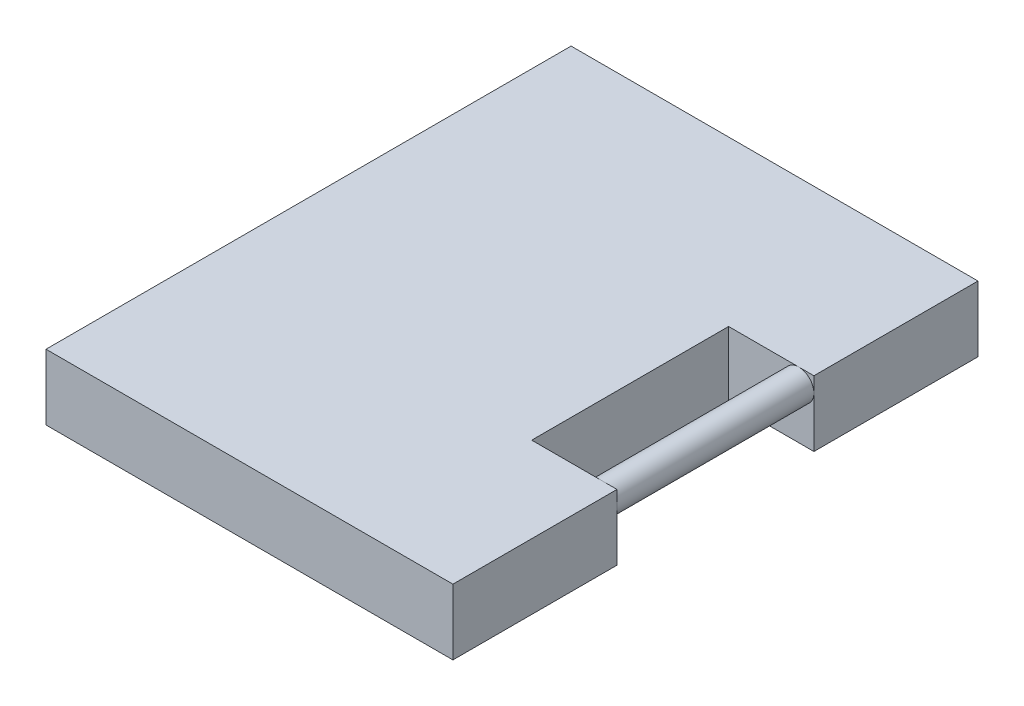
ISO-10303-21;
HEADER;
FILE_DESCRIPTION(('STEP AP214'),'2;1');
FILE_NAME('part.step','',(''),(''),'','','');
FILE_SCHEMA(('AUTOMOTIVE_DESIGN { 1 0 10303 214 1 1 1 1 }'));
ENDSEC;
DATA;
#1=APPLICATION_CONTEXT('core data for automotive mechanical design processes');
#2=APPLICATION_PROTOCOL_DEFINITION('international standard','automotive_design',2000,#1);
#3=PRODUCT_CONTEXT('',#1,'mechanical');
#4=PRODUCT('Part','Part','',(#3));
#5=PRODUCT_RELATED_PRODUCT_CATEGORY('part','',(#4));
#6=PRODUCT_DEFINITION_FORMATION('','',#4);
#7=PRODUCT_DEFINITION_CONTEXT('part definition',#1,'design');
#8=PRODUCT_DEFINITION('design','',#6,#7);
#9=PRODUCT_DEFINITION_SHAPE('','',#8);
#10=(LENGTH_UNIT() NAMED_UNIT(*) SI_UNIT(.MILLI.,.METRE.));
#11=(NAMED_UNIT(*) PLANE_ANGLE_UNIT() SI_UNIT($,.RADIAN.));
#12=(NAMED_UNIT(*) SI_UNIT($,.STERADIAN.) SOLID_ANGLE_UNIT());
#13=UNCERTAINTY_MEASURE_WITH_UNIT(LENGTH_MEASURE(1.E-05),#10,'distance_accuracy_value','');
#14=(GEOMETRIC_REPRESENTATION_CONTEXT(3) GLOBAL_UNCERTAINTY_ASSIGNED_CONTEXT((#13)) GLOBAL_UNIT_ASSIGNED_CONTEXT((#10,
#11,#12)) REPRESENTATION_CONTEXT('',''));
#15=CARTESIAN_POINT('',(0.,0.,0.));
#16=DIRECTION('',(0.,0.,1.));
#17=DIRECTION('',(1.,0.,0.));
#18=AXIS2_PLACEMENT_3D('',#15,#16,#17);
#19=CARTESIAN_POINT('',(155.,50.,75.));
#20=DIRECTION('',(0.,0.,1.));
#21=DIRECTION('',(1.,0.,0.));
#22=AXIS2_PLACEMENT_3D('',#19,#20,#21);
#23=PLANE('',#22);
#24=CARTESIAN_POINT('',(143.5,38.5,75.));
#25=DIRECTION('',(0.,0.,1.));
#26=DIRECTION('',(1.,0.,0.));
#27=AXIS2_PLACEMENT_3D('',#24,#25,#26);
#28=CIRCLE('',#27,11.5);
#29=CARTESIAN_POINT('',(143.5,50.,75.));
#30=VERTEX_POINT('',#29);
#31=CARTESIAN_POINT('',(155.,38.5,75.));
#32=VERTEX_POINT('',#31);
#33=EDGE_CURVE('E135',#30,#32,#28,.T.);
#34=ORIENTED_EDGE('',*,*,#33,.T.);
#35=DIRECTION('',(0.,-1.,0.));
#36=VECTOR('',#35,1.);
#37=CARTESIAN_POINT('',(155.,50.,75.));
#38=LINE('',#37,#36);
#39=CARTESIAN_POINT('',(155.,0.,75.));
#40=VERTEX_POINT('',#39);
#41=EDGE_CURVE('E123',#32,#40,#38,.T.);
#42=ORIENTED_EDGE('',*,*,#41,.T.);
#43=DIRECTION('',(-1.,0.,0.));
#44=VECTOR('',#43,1.);
#45=CARTESIAN_POINT('',(155.,0.,75.));
#46=LINE('',#45,#44);
#47=CARTESIAN_POINT('',(90.,0.,75.));
#48=VERTEX_POINT('',#47);
#49=EDGE_CURVE('E174',#40,#48,#46,.T.);
#50=ORIENTED_EDGE('',*,*,#49,.T.);
#51=DIRECTION('',(0.,-1.,0.));
#52=VECTOR('',#51,1.);
#53=CARTESIAN_POINT('',(90.,50.,75.));
#54=LINE('',#53,#52);
#55=CARTESIAN_POINT('',(90.,50.,75.));
#56=VERTEX_POINT('',#55);
#57=EDGE_CURVE('E133',#56,#48,#54,.T.);
#58=ORIENTED_EDGE('',*,*,#57,.F.);
#59=DIRECTION('',(-1.,0.,0.));
#60=VECTOR('',#59,1.);
#61=CARTESIAN_POINT('',(155.,50.,75.));
#62=LINE('',#61,#60);
#63=EDGE_CURVE('E137',#30,#56,#62,.T.);
#64=ORIENTED_EDGE('',*,*,#63,.F.);
#65=EDGE_LOOP('',(#34,#42,#50,#58,#64));
#66=FACE_BOUND('',#65,.T.);
#67=ADVANCED_FACE('F37',(#66),#23,.F.);
#68=CARTESIAN_POINT('',(90.,50.,-75.));
#69=DIRECTION('',(0.,0.,-1.));
#70=DIRECTION('',(-1.,0.,0.));
#71=AXIS2_PLACEMENT_3D('',#68,#69,#70);
#72=PLANE('',#71);
#73=CARTESIAN_POINT('',(143.5,38.5,-75.));
#74=DIRECTION('',(0.,0.,1.));
#75=DIRECTION('',(1.,0.,0.));
#76=AXIS2_PLACEMENT_3D('',#73,#74,#75);
#77=CIRCLE('',#76,11.5);
#78=CARTESIAN_POINT('',(155.,38.5,-75.));
#79=VERTEX_POINT('',#78);
#80=CARTESIAN_POINT('',(143.5,50.,-75.));
#81=VERTEX_POINT('',#80);
#82=EDGE_CURVE('E139',#79,#81,#77,.T.);
#83=ORIENTED_EDGE('',*,*,#82,.F.);
#84=DIRECTION('',(0.,-1.,0.));
#85=VECTOR('',#84,1.);
#86=CARTESIAN_POINT('',(155.,50.,-75.));
#87=LINE('',#86,#85);
#88=CARTESIAN_POINT('',(155.,50.,-75.));
#89=VERTEX_POINT('',#88);
#90=EDGE_CURVE('E180',#89,#79,#87,.T.);
#91=ORIENTED_EDGE('',*,*,#90,.F.);
#92=DIRECTION('',(1.,0.,0.));
#93=VECTOR('',#92,1.);
#94=CARTESIAN_POINT('',(90.,50.,-75.));
#95=LINE('',#94,#93);
#96=EDGE_CURVE('E163',#81,#89,#95,.T.);
#97=ORIENTED_EDGE('',*,*,#96,.F.);
#98=EDGE_LOOP('',(#83,#91,#97));
#99=FACE_BOUND('',#98,.T.);
#100=ADVANCED_FACE('F224',(#99),#72,.F.);
#101=CARTESIAN_POINT('',(155.,50.,-75.));
#102=DIRECTION('',(-1.,0.,0.));
#103=DIRECTION('',(0.,0.,1.));
#104=AXIS2_PLACEMENT_3D('',#101,#102,#103);
#105=PLANE('',#104);
#106=DIRECTION('',(0.,0.,-1.));
#107=VECTOR('',#106,1.);
#108=CARTESIAN_POINT('',(155.,0.,-75.));
#109=LINE('',#108,#107);
#110=CARTESIAN_POINT('',(155.,0.,-75.));
#111=VERTEX_POINT('',#110);
#112=CARTESIAN_POINT('',(155.,0.,-200.));
#113=VERTEX_POINT('',#112);
#114=EDGE_CURVE('E142',#111,#113,#109,.T.);
#115=ORIENTED_EDGE('',*,*,#114,.T.);
#116=DIRECTION('',(0.,-1.,0.));
#117=VECTOR('',#116,1.);
#118=CARTESIAN_POINT('',(155.,50.,-200.));
#119=LINE('',#118,#117);
#120=CARTESIAN_POINT('',(155.,50.,-200.));
#121=VERTEX_POINT('',#120);
#122=EDGE_CURVE('E11',#121,#113,#119,.T.);
#123=ORIENTED_EDGE('',*,*,#122,.F.);
#124=DIRECTION('',(0.,0.,-1.));
#125=VECTOR('',#124,1.);
#126=CARTESIAN_POINT('',(155.,50.,-75.));
#127=LINE('',#126,#125);
#128=EDGE_CURVE('E148',#89,#121,#127,.T.);
#129=ORIENTED_EDGE('',*,*,#128,.F.);
#130=ORIENTED_EDGE('',*,*,#90,.T.);
#131=EDGE_CURVE('E166',#79,#111,#87,.T.);
#132=ORIENTED_EDGE('',*,*,#131,.T.);
#133=EDGE_LOOP('',(#115,#123,#129,#130,#132));
#134=FACE_BOUND('',#133,.T.);
#135=ADVANCED_FACE('F39',(#134),#105,.F.);
#136=CARTESIAN_POINT('',(-155.,50.,-200.));
#137=DIRECTION('',(0.,0.,1.));
#138=DIRECTION('',(1.,0.,0.));
#139=AXIS2_PLACEMENT_3D('',#136,#137,#138);
#140=PLANE('',#139);
#141=DIRECTION('',(-1.,0.,0.));
#142=VECTOR('',#141,1.);
#143=CARTESIAN_POINT('',(-155.,0.,-200.));
#144=LINE('',#143,#142);
#145=CARTESIAN_POINT('',(-155.,0.,-200.));
#146=VERTEX_POINT('',#145);
#147=EDGE_CURVE('E144',#113,#146,#144,.T.);
#148=ORIENTED_EDGE('',*,*,#147,.T.);
#149=DIRECTION('',(0.,-1.,0.));
#150=VECTOR('',#149,1.);
#151=CARTESIAN_POINT('',(-155.,50.,-200.));
#152=LINE('',#151,#150);
#153=CARTESIAN_POINT('',(-155.,50.,-200.));
#154=VERTEX_POINT('',#153);
#155=EDGE_CURVE('E45',#154,#146,#152,.T.);
#156=ORIENTED_EDGE('',*,*,#155,.F.);
#157=DIRECTION('',(-1.,0.,0.));
#158=VECTOR('',#157,1.);
#159=CARTESIAN_POINT('',(-155.,50.,-200.));
#160=LINE('',#159,#158);
#161=EDGE_CURVE('E151',#121,#154,#160,.T.);
#162=ORIENTED_EDGE('',*,*,#161,.F.);
#163=ORIENTED_EDGE('',*,*,#122,.T.);
#164=EDGE_LOOP('',(#148,#156,#162,#163));
#165=FACE_BOUND('',#164,.T.);
#166=ADVANCED_FACE('F210',(#165),#140,.F.);
#167=CARTESIAN_POINT('',(-155.,50.,200.));
#168=DIRECTION('',(1.,0.,0.));
#169=DIRECTION('',(0.,0.,-1.));
#170=AXIS2_PLACEMENT_3D('',#167,#168,#169);
#171=PLANE('',#170);
#172=DIRECTION('',(0.,0.,1.));
#173=VECTOR('',#172,1.);
#174=CARTESIAN_POINT('',(-155.,0.,200.));
#175=LINE('',#174,#173);
#176=CARTESIAN_POINT('',(-155.,0.,200.));
#177=VERTEX_POINT('',#176);
#178=EDGE_CURVE('E169',#146,#177,#175,.T.);
#179=ORIENTED_EDGE('',*,*,#178,.T.);
#180=DIRECTION('',(0.,-1.,0.));
#181=VECTOR('',#180,1.);
#182=CARTESIAN_POINT('',(-155.,50.,200.));
#183=LINE('',#182,#181);
#184=CARTESIAN_POINT('',(-155.,50.,200.));
#185=VERTEX_POINT('',#184);
#186=EDGE_CURVE('E188',#185,#177,#183,.T.);
#187=ORIENTED_EDGE('',*,*,#186,.F.);
#188=DIRECTION('',(0.,0.,1.));
#189=VECTOR('',#188,1.);
#190=CARTESIAN_POINT('',(-155.,50.,200.));
#191=LINE('',#190,#189);
#192=EDGE_CURVE('E154',#154,#185,#191,.T.);
#193=ORIENTED_EDGE('',*,*,#192,.F.);
#194=ORIENTED_EDGE('',*,*,#155,.T.);
#195=EDGE_LOOP('',(#179,#187,#193,#194));
#196=FACE_BOUND('',#195,.T.);
#197=ADVANCED_FACE('F195',(#196),#171,.F.);
#198=CARTESIAN_POINT('',(-155.,50.,200.));
#199=DIRECTION('',(0.,0.,-1.));
#200=DIRECTION('',(-1.,0.,0.));
#201=AXIS2_PLACEMENT_3D('',#198,#199,#200);
#202=PLANE('',#201);
#203=DIRECTION('',(1.,0.,0.));
#204=VECTOR('',#203,1.);
#205=CARTESIAN_POINT('',(-155.,0.,200.));
#206=LINE('',#205,#204);
#207=CARTESIAN_POINT('',(155.,0.,200.));
#208=VERTEX_POINT('',#207);
#209=EDGE_CURVE('E171',#177,#208,#206,.T.);
#210=ORIENTED_EDGE('',*,*,#209,.T.);
#211=DIRECTION('',(0.,-1.,0.));
#212=VECTOR('',#211,1.);
#213=CARTESIAN_POINT('',(155.,50.,200.));
#214=LINE('',#213,#212);
#215=CARTESIAN_POINT('',(155.,50.,200.));
#216=VERTEX_POINT('',#215);
#217=EDGE_CURVE('E122',#216,#208,#214,.T.);
#218=ORIENTED_EDGE('',*,*,#217,.F.);
#219=DIRECTION('',(1.,0.,0.));
#220=VECTOR('',#219,1.);
#221=CARTESIAN_POINT('',(-155.,50.,200.));
#222=LINE('',#221,#220);
#223=EDGE_CURVE('E156',#185,#216,#222,.T.);
#224=ORIENTED_EDGE('',*,*,#223,.F.);
#225=ORIENTED_EDGE('',*,*,#186,.T.);
#226=EDGE_LOOP('',(#210,#218,#224,#225));
#227=FACE_BOUND('',#226,.T.);
#228=ADVANCED_FACE('F204',(#227),#202,.F.);
#229=CARTESIAN_POINT('',(155.,50.,200.));
#230=DIRECTION('',(-1.,0.,0.));
#231=DIRECTION('',(0.,0.,1.));
#232=AXIS2_PLACEMENT_3D('',#229,#230,#231);
#233=PLANE('',#232);
#234=DIRECTION('',(0.,0.,-1.));
#235=VECTOR('',#234,1.);
#236=CARTESIAN_POINT('',(155.,0.,200.));
#237=LINE('',#236,#235);
#238=EDGE_CURVE('E130',#208,#40,#237,.T.);
#239=ORIENTED_EDGE('',*,*,#238,.T.);
#240=ORIENTED_EDGE('',*,*,#41,.F.);
#241=CARTESIAN_POINT('',(155.,50.,75.));
#242=VERTEX_POINT('',#241);
#243=EDGE_CURVE('E115',#242,#32,#38,.T.);
#244=ORIENTED_EDGE('',*,*,#243,.F.);
#245=DIRECTION('',(0.,0.,-1.));
#246=VECTOR('',#245,1.);
#247=CARTESIAN_POINT('',(155.,50.,200.));
#248=LINE('',#247,#246);
#249=EDGE_CURVE('E158',#216,#242,#248,.T.);
#250=ORIENTED_EDGE('',*,*,#249,.F.);
#251=ORIENTED_EDGE('',*,*,#217,.T.);
#252=EDGE_LOOP('',(#239,#240,#244,#250,#251));
#253=FACE_BOUND('',#252,.T.);
#254=ADVANCED_FACE('F127',(#253),#233,.F.);
#255=EDGE_CURVE('E60',#32,#30,#28,.T.);
#256=ORIENTED_EDGE('',*,*,#255,.T.);
#257=EDGE_CURVE('E119',#242,#30,#62,.T.);
#258=ORIENTED_EDGE('',*,*,#257,.F.);
#259=ORIENTED_EDGE('',*,*,#243,.T.);
#260=EDGE_LOOP('',(#256,#258,#259));
#261=FACE_BOUND('',#260,.T.);
#262=ADVANCED_FACE('F117',(#261),#23,.F.);
#263=CARTESIAN_POINT('',(90.,50.,75.));
#264=DIRECTION('',(-1.,0.,0.));
#265=DIRECTION('',(0.,0.,1.));
#266=AXIS2_PLACEMENT_3D('',#263,#264,#265);
#267=PLANE('',#266);
#268=DIRECTION('',(0.,0.,-1.));
#269=VECTOR('',#268,1.);
#270=CARTESIAN_POINT('',(90.,0.,75.));
#271=LINE('',#270,#269);
#272=CARTESIAN_POINT('',(90.,0.,-75.));
#273=VERTEX_POINT('',#272);
#274=EDGE_CURVE('E176',#48,#273,#271,.T.);
#275=ORIENTED_EDGE('',*,*,#274,.T.);
#276=DIRECTION('',(0.,-1.,0.));
#277=VECTOR('',#276,1.);
#278=CARTESIAN_POINT('',(90.,50.,-75.));
#279=LINE('',#278,#277);
#280=CARTESIAN_POINT('',(90.,50.,-75.));
#281=VERTEX_POINT('',#280);
#282=EDGE_CURVE('E182',#281,#273,#279,.T.);
#283=ORIENTED_EDGE('',*,*,#282,.F.);
#284=DIRECTION('',(0.,0.,-1.));
#285=VECTOR('',#284,1.);
#286=CARTESIAN_POINT('',(90.,50.,75.));
#287=LINE('',#286,#285);
#288=EDGE_CURVE('E161',#56,#281,#287,.T.);
#289=ORIENTED_EDGE('',*,*,#288,.F.);
#290=ORIENTED_EDGE('',*,*,#57,.T.);
#291=EDGE_LOOP('',(#275,#283,#289,#290));
#292=FACE_BOUND('',#291,.T.);
#293=ADVANCED_FACE('F219',(#292),#267,.F.);
#294=EDGE_CURVE('E52',#81,#79,#77,.T.);
#295=ORIENTED_EDGE('',*,*,#294,.F.);
#296=EDGE_CURVE('E164',#281,#81,#95,.T.);
#297=ORIENTED_EDGE('',*,*,#296,.F.);
#298=ORIENTED_EDGE('',*,*,#282,.T.);
#299=DIRECTION('',(1.,0.,0.));
#300=VECTOR('',#299,1.);
#301=CARTESIAN_POINT('',(90.,0.,-75.));
#302=LINE('',#301,#300);
#303=EDGE_CURVE('E152',#273,#111,#302,.T.);
#304=ORIENTED_EDGE('',*,*,#303,.T.);
#305=ORIENTED_EDGE('',*,*,#131,.F.);
#306=EDGE_LOOP('',(#295,#297,#298,#304,#305));
#307=FACE_BOUND('',#306,.T.);
#308=ADVANCED_FACE('F214',(#307),#72,.F.);
#309=CARTESIAN_POINT('',(0.,50.,0.));
#310=DIRECTION('',(0.,-1.,0.));
#311=DIRECTION('',(0.,0.,-1.));
#312=AXIS2_PLACEMENT_3D('',#309,#310,#311);
#313=PLANE('',#312);
#314=ORIENTED_EDGE('',*,*,#128,.T.);
#315=ORIENTED_EDGE('',*,*,#161,.T.);
#316=ORIENTED_EDGE('',*,*,#192,.T.);
#317=ORIENTED_EDGE('',*,*,#223,.T.);
#318=ORIENTED_EDGE('',*,*,#249,.T.);
#319=ORIENTED_EDGE('',*,*,#257,.T.);
#320=ORIENTED_EDGE('',*,*,#63,.T.);
#321=ORIENTED_EDGE('',*,*,#288,.T.);
#322=ORIENTED_EDGE('',*,*,#296,.T.);
#323=ORIENTED_EDGE('',*,*,#96,.T.);
#324=EDGE_LOOP('',(#314,#315,#316,#317,#318,#319,#320,#321,#322,#323));
#325=FACE_BOUND('',#324,.T.);
#326=ADVANCED_FACE('F207',(#325),#313,.F.);
#327=CARTESIAN_POINT('',(0.,0.,0.));
#328=DIRECTION('',(0.,-1.,0.));
#329=DIRECTION('',(0.,0.,-1.));
#330=AXIS2_PLACEMENT_3D('',#327,#328,#329);
#331=PLANE('',#330);
#332=ORIENTED_EDGE('',*,*,#114,.F.);
#333=ORIENTED_EDGE('',*,*,#303,.F.);
#334=ORIENTED_EDGE('',*,*,#274,.F.);
#335=ORIENTED_EDGE('',*,*,#49,.F.);
#336=ORIENTED_EDGE('',*,*,#238,.F.);
#337=ORIENTED_EDGE('',*,*,#209,.F.);
#338=ORIENTED_EDGE('',*,*,#178,.F.);
#339=ORIENTED_EDGE('',*,*,#147,.F.);
#340=EDGE_LOOP('',(#332,#333,#334,#335,#336,#337,#338,#339));
#341=FACE_BOUND('',#340,.T.);
#342=ADVANCED_FACE('F201',(#341),#331,.T.);
#343=CARTESIAN_POINT('',(143.5,38.5,107.526911934581));
#344=DIRECTION('',(0.,0.,-1.));
#345=DIRECTION('',(-1.,0.,0.));
#346=AXIS2_PLACEMENT_3D('',#343,#344,#345);
#347=CYLINDRICAL_SURFACE('',#346,11.5);
#348=ORIENTED_EDGE('',*,*,#82,.T.);
#349=ORIENTED_EDGE('',*,*,#294,.T.);
#350=EDGE_LOOP('',(#348,#349));
#351=FACE_BOUND('',#350,.T.);
#352=ORIENTED_EDGE('',*,*,#255,.F.);
#353=ORIENTED_EDGE('',*,*,#33,.F.);
#354=EDGE_LOOP('',(#352,#353));
#355=FACE_BOUND('',#354,.T.);
#356=ADVANCED_FACE('F141',(#351,#355),#347,.T.);
#357=CLOSED_SHELL('',(#67,#100,#135,#166,#197,#228,#254,#262,#293,#308,#326,#342,#356));
#358=MANIFOLD_SOLID_BREP('B2',#357);
#359=ADVANCED_BREP_SHAPE_REPRESENTATION('',(#18,#358),#14);
#360=SHAPE_DEFINITION_REPRESENTATION(#9,#359);
ENDSEC;
END-ISO-10303-21;
